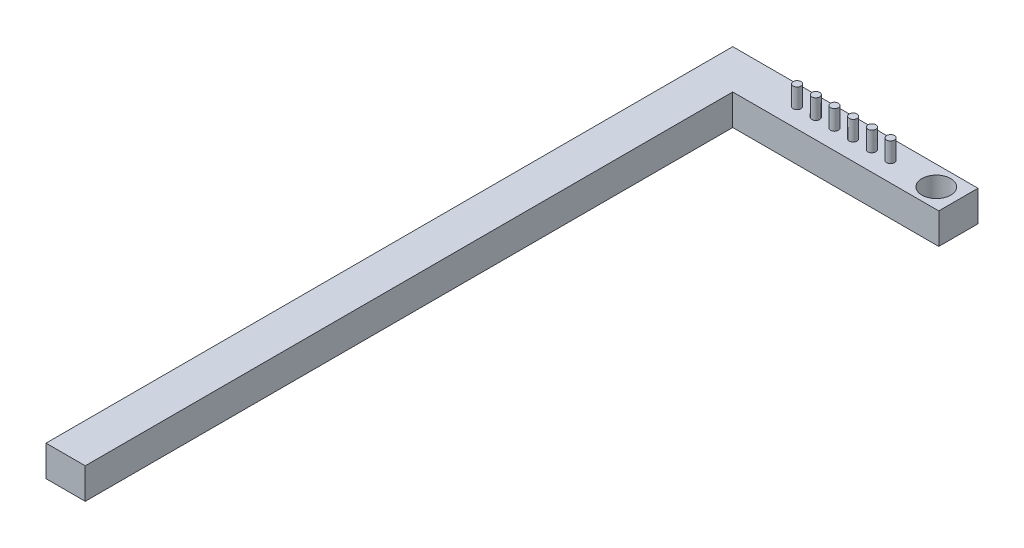
ISO-10303-21;
HEADER;
FILE_DESCRIPTION(('STEP AP214'),'2;1');
FILE_NAME('part.step','',(''),(''),'','','');
FILE_SCHEMA(('AUTOMOTIVE_DESIGN { 1 0 10303 214 1 1 1 1 }'));
ENDSEC;
DATA;
#1=APPLICATION_CONTEXT('core data for automotive mechanical design processes');
#2=APPLICATION_PROTOCOL_DEFINITION('international standard','automotive_design',2000,#1);
#3=PRODUCT_CONTEXT('',#1,'mechanical');
#4=PRODUCT('Part','Part','',(#3));
#5=PRODUCT_RELATED_PRODUCT_CATEGORY('part','',(#4));
#6=PRODUCT_DEFINITION_FORMATION('','',#4);
#7=PRODUCT_DEFINITION_CONTEXT('part definition',#1,'design');
#8=PRODUCT_DEFINITION('design','',#6,#7);
#9=PRODUCT_DEFINITION_SHAPE('','',#8);
#10=(LENGTH_UNIT() NAMED_UNIT(*) SI_UNIT(.MILLI.,.METRE.));
#11=(NAMED_UNIT(*) PLANE_ANGLE_UNIT() SI_UNIT($,.RADIAN.));
#12=(NAMED_UNIT(*) SI_UNIT($,.STERADIAN.) SOLID_ANGLE_UNIT());
#13=UNCERTAINTY_MEASURE_WITH_UNIT(LENGTH_MEASURE(1.E-05),#10,'distance_accuracy_value','');
#14=(GEOMETRIC_REPRESENTATION_CONTEXT(3) GLOBAL_UNCERTAINTY_ASSIGNED_CONTEXT((#13)) GLOBAL_UNIT_ASSIGNED_CONTEXT((#10,
#11,#12)) REPRESENTATION_CONTEXT('',''));
#15=CARTESIAN_POINT('',(0.,0.,0.));
#16=DIRECTION('',(0.,0.,1.));
#17=DIRECTION('',(1.,0.,0.));
#18=AXIS2_PLACEMENT_3D('',#15,#16,#17);
#19=CARTESIAN_POINT('',(0.,3.14,0.));
#20=DIRECTION('',(0.,-1.,0.));
#21=DIRECTION('',(0.,0.,-1.));
#22=AXIS2_PLACEMENT_3D('',#19,#20,#21);
#23=PLANE('',#22);
#24=CARTESIAN_POINT('',(5.58910010634148,3.14,0.000995637473865652));
#25=DIRECTION('',(0.,-1.,0.));
#26=DIRECTION('',(0.,0.,-1.));
#27=AXIS2_PLACEMENT_3D('',#24,#25,#26);
#28=CIRCLE('',#27,0.4);
#29=CARTESIAN_POINT('',(5.58910010634148,3.14,-0.399004362526135));
#30=VERTEX_POINT('',#29);
#31=EDGE_CURVE('E11',#30,#30,#28,.F.);
#32=ORIENTED_EDGE('',*,*,#31,.F.);
#33=EDGE_LOOP('',(#32));
#34=FACE_BOUND('',#33,.T.);
#35=CARTESIAN_POINT('',(3.6841001498053,3.14,0.00140257377108595));
#36=DIRECTION('',(0.,-1.,0.));
#37=DIRECTION('',(0.,0.,-1.));
#38=AXIS2_PLACEMENT_3D('',#35,#36,#37);
#39=CIRCLE('',#38,0.4);
#40=CARTESIAN_POINT('',(3.6841001498053,3.14,-0.398597426228915));
#41=VERTEX_POINT('',#40);
#42=EDGE_CURVE('E42',#41,#41,#39,.F.);
#43=ORIENTED_EDGE('',*,*,#42,.F.);
#44=EDGE_LOOP('',(#43));
#45=FACE_BOUND('',#44,.T.);
#46=CARTESIAN_POINT('',(1.77910019326912,3.14,0.00180951006830624));
#47=DIRECTION('',(0.,-1.,0.));
#48=DIRECTION('',(0.,0.,-1.));
#49=AXIS2_PLACEMENT_3D('',#46,#47,#48);
#50=CIRCLE('',#49,0.4);
#51=CARTESIAN_POINT('',(1.77910019326912,3.14,-0.398190489931694));
#52=VERTEX_POINT('',#51);
#53=EDGE_CURVE('E149',#52,#52,#50,.F.);
#54=ORIENTED_EDGE('',*,*,#53,.F.);
#55=EDGE_LOOP('',(#54));
#56=FACE_BOUND('',#55,.T.);
#57=CARTESIAN_POINT('',(-0.125899763267059,3.14,0.00221644636552653));
#58=DIRECTION('',(0.,-1.,0.));
#59=DIRECTION('',(0.,0.,-1.));
#60=AXIS2_PLACEMENT_3D('',#57,#58,#59);
#61=CIRCLE('',#60,0.4);
#62=CARTESIAN_POINT('',(-0.125899763267059,3.14,-0.397783553634473));
#63=VERTEX_POINT('',#62);
#64=EDGE_CURVE('E146',#63,#63,#61,.F.);
#65=ORIENTED_EDGE('',*,*,#64,.F.);
#66=EDGE_LOOP('',(#65));
#67=FACE_BOUND('',#66,.T.);
#68=CARTESIAN_POINT('',(-2.03089971980324,3.14,0.00262338266274683));
#69=DIRECTION('',(0.,-1.,0.));
#70=DIRECTION('',(0.,0.,-1.));
#71=AXIS2_PLACEMENT_3D('',#68,#69,#70);
#72=CIRCLE('',#71,0.4);
#73=CARTESIAN_POINT('',(-2.03089971980324,3.14,-0.397376617337253));
#74=VERTEX_POINT('',#73);
#75=EDGE_CURVE('E143',#74,#74,#72,.F.);
#76=ORIENTED_EDGE('',*,*,#75,.F.);
#77=EDGE_LOOP('',(#76));
#78=FACE_BOUND('',#77,.T.);
#79=CARTESIAN_POINT('',(-3.93589967633942,3.14,0.00303031895996539));
#80=DIRECTION('',(0.,-1.,0.));
#81=DIRECTION('',(0.,0.,-1.));
#82=AXIS2_PLACEMENT_3D('',#79,#80,#81);
#83=CIRCLE('',#82,0.4);
#84=CARTESIAN_POINT('',(-3.93589967633942,3.14,-0.396969681040035));
#85=VERTEX_POINT('',#84);
#86=EDGE_CURVE('E140',#85,#85,#83,.F.);
#87=ORIENTED_EDGE('',*,*,#86,.F.);
#88=EDGE_LOOP('',(#87));
#89=FACE_BOUND('',#88,.T.);
#90=DIRECTION('',(1.,0.,0.));
#91=VECTOR('',#90,1.);
#92=CARTESIAN_POINT('',(-8.49999999999999,3.14,2.));
#93=LINE('',#92,#91);
#94=CARTESIAN_POINT('',(-8.49999999999999,3.14,2.));
#95=VERTEX_POINT('',#94);
#96=CARTESIAN_POINT('',(12.5,3.14,2.));
#97=VERTEX_POINT('',#96);
#98=EDGE_CURVE('E131',#95,#97,#93,.T.);
#99=ORIENTED_EDGE('',*,*,#98,.T.);
#100=DIRECTION('',(0.,0.,-1.));
#101=VECTOR('',#100,1.);
#102=CARTESIAN_POINT('',(12.5,3.14,-2.));
#103=LINE('',#102,#101);
#104=CARTESIAN_POINT('',(12.5,3.14,-2.));
#105=VERTEX_POINT('',#104);
#106=EDGE_CURVE('E88',#97,#105,#103,.T.);
#107=ORIENTED_EDGE('',*,*,#106,.T.);
#108=DIRECTION('',(-1.,0.,0.));
#109=VECTOR('',#108,1.);
#110=CARTESIAN_POINT('',(-8.49999999999999,3.14,-2.));
#111=LINE('',#110,#109);
#112=CARTESIAN_POINT('',(-12.5,3.14,-2.));
#113=VERTEX_POINT('',#112);
#114=EDGE_CURVE('E101',#105,#113,#111,.T.);
#115=ORIENTED_EDGE('',*,*,#114,.T.);
#116=DIRECTION('',(0.,0.,1.));
#117=VECTOR('',#116,1.);
#118=CARTESIAN_POINT('',(-12.5,3.14,-2.));
#119=LINE('',#118,#117);
#120=CARTESIAN_POINT('',(-12.5,3.14,68.));
#121=VERTEX_POINT('',#120);
#122=EDGE_CURVE('E95',#113,#121,#119,.T.);
#123=ORIENTED_EDGE('',*,*,#122,.T.);
#124=DIRECTION('',(1.,0.,0.));
#125=VECTOR('',#124,1.);
#126=CARTESIAN_POINT('',(-8.49999999999998,3.14,68.));
#127=LINE('',#126,#125);
#128=CARTESIAN_POINT('',(-8.49999999999998,3.14,68.));
#129=VERTEX_POINT('',#128);
#130=EDGE_CURVE('E99',#121,#129,#127,.T.);
#131=ORIENTED_EDGE('',*,*,#130,.T.);
#132=DIRECTION('',(0.,0.,-1.));
#133=VECTOR('',#132,1.);
#134=CARTESIAN_POINT('',(-8.49999999999999,3.14,2.));
#135=LINE('',#134,#133);
#136=EDGE_CURVE('E50',#129,#95,#135,.T.);
#137=ORIENTED_EDGE('',*,*,#136,.T.);
#138=EDGE_LOOP('',(#99,#107,#115,#123,#131,#137));
#139=FACE_BOUND('',#138,.T.);
#140=CARTESIAN_POINT('',(10.25,3.14,0.));
#141=DIRECTION('',(0.,1.,0.));
#142=DIRECTION('',(0.,0.,1.));
#143=AXIS2_PLACEMENT_3D('',#140,#141,#142);
#144=CIRCLE('',#143,1.47);
#145=CARTESIAN_POINT('',(10.25,3.14,1.47));
#146=VERTEX_POINT('',#145);
#147=EDGE_CURVE('E123',#146,#146,#144,.T.);
#148=ORIENTED_EDGE('',*,*,#147,.F.);
#149=EDGE_LOOP('',(#148));
#150=FACE_BOUND('',#149,.T.);
#151=ADVANCED_FACE('F33',(#34,#45,#56,#67,#78,#89,#139,#150),#23,.F.);
#152=CARTESIAN_POINT('',(0.,0.,0.));
#153=DIRECTION('',(0.,-1.,0.));
#154=DIRECTION('',(0.,0.,-1.));
#155=AXIS2_PLACEMENT_3D('',#152,#153,#154);
#156=PLANE('',#155);
#157=DIRECTION('',(1.,0.,0.));
#158=VECTOR('',#157,1.);
#159=CARTESIAN_POINT('',(-8.49999999999999,0.,2.));
#160=LINE('',#159,#158);
#161=CARTESIAN_POINT('',(-8.49999999999999,0.,2.));
#162=VERTEX_POINT('',#161);
#163=CARTESIAN_POINT('',(12.5,0.,2.));
#164=VERTEX_POINT('',#163);
#165=EDGE_CURVE('E119',#162,#164,#160,.T.);
#166=ORIENTED_EDGE('',*,*,#165,.F.);
#167=DIRECTION('',(0.,0.,-1.));
#168=VECTOR('',#167,1.);
#169=CARTESIAN_POINT('',(-8.49999999999999,0.,2.));
#170=LINE('',#169,#168);
#171=CARTESIAN_POINT('',(-8.49999999999998,0.,68.));
#172=VERTEX_POINT('',#171);
#173=EDGE_CURVE('E79',#172,#162,#170,.T.);
#174=ORIENTED_EDGE('',*,*,#173,.F.);
#175=DIRECTION('',(1.,0.,0.));
#176=VECTOR('',#175,1.);
#177=CARTESIAN_POINT('',(-8.49999999999998,0.,68.));
#178=LINE('',#177,#176);
#179=CARTESIAN_POINT('',(-12.5,0.,68.));
#180=VERTEX_POINT('',#179);
#181=EDGE_CURVE('E73',#180,#172,#178,.T.);
#182=ORIENTED_EDGE('',*,*,#181,.F.);
#183=DIRECTION('',(0.,0.,1.));
#184=VECTOR('',#183,1.);
#185=CARTESIAN_POINT('',(-12.5,0.,-2.));
#186=LINE('',#185,#184);
#187=CARTESIAN_POINT('',(-12.5,0.,-2.));
#188=VERTEX_POINT('',#187);
#189=EDGE_CURVE('E109',#188,#180,#186,.T.);
#190=ORIENTED_EDGE('',*,*,#189,.F.);
#191=DIRECTION('',(-1.,0.,0.));
#192=VECTOR('',#191,1.);
#193=CARTESIAN_POINT('',(-8.49999999999999,0.,-2.));
#194=LINE('',#193,#192);
#195=CARTESIAN_POINT('',(12.5,0.,-2.));
#196=VERTEX_POINT('',#195);
#197=EDGE_CURVE('E126',#196,#188,#194,.T.);
#198=ORIENTED_EDGE('',*,*,#197,.F.);
#199=DIRECTION('',(0.,0.,-1.));
#200=VECTOR('',#199,1.);
#201=CARTESIAN_POINT('',(12.5,0.,-2.));
#202=LINE('',#201,#200);
#203=EDGE_CURVE('E122',#164,#196,#202,.T.);
#204=ORIENTED_EDGE('',*,*,#203,.F.);
#205=EDGE_LOOP('',(#166,#174,#182,#190,#198,#204));
#206=FACE_BOUND('',#205,.T.);
#207=CARTESIAN_POINT('',(10.25,0.,0.));
#208=DIRECTION('',(0.,1.,0.));
#209=DIRECTION('',(0.,0.,1.));
#210=AXIS2_PLACEMENT_3D('',#207,#208,#209);
#211=CIRCLE('',#210,1.47);
#212=CARTESIAN_POINT('',(10.25,0.,1.47));
#213=VERTEX_POINT('',#212);
#214=EDGE_CURVE('E211',#213,#213,#211,.T.);
#215=ORIENTED_EDGE('',*,*,#214,.T.);
#216=EDGE_LOOP('',(#215));
#217=FACE_BOUND('',#216,.T.);
#218=ADVANCED_FACE('F158',(#206,#217),#156,.T.);
#219=CARTESIAN_POINT('',(-8.49999999999999,3.14,2.));
#220=DIRECTION('',(0.,0.,-1.));
#221=DIRECTION('',(-1.,0.,0.));
#222=AXIS2_PLACEMENT_3D('',#219,#220,#221);
#223=PLANE('',#222);
#224=ORIENTED_EDGE('',*,*,#165,.T.);
#225=DIRECTION('',(0.,-1.,0.));
#226=VECTOR('',#225,1.);
#227=CARTESIAN_POINT('',(12.5,3.14,2.));
#228=LINE('',#227,#226);
#229=EDGE_CURVE('E138',#97,#164,#228,.T.);
#230=ORIENTED_EDGE('',*,*,#229,.F.);
#231=ORIENTED_EDGE('',*,*,#98,.F.);
#232=DIRECTION('',(0.,-1.,0.));
#233=VECTOR('',#232,1.);
#234=CARTESIAN_POINT('',(-8.49999999999999,3.14,2.));
#235=LINE('',#234,#233);
#236=EDGE_CURVE('E115',#95,#162,#235,.T.);
#237=ORIENTED_EDGE('',*,*,#236,.T.);
#238=EDGE_LOOP('',(#224,#230,#231,#237));
#239=FACE_BOUND('',#238,.T.);
#240=ADVANCED_FACE('F35',(#239),#223,.F.);
#241=CARTESIAN_POINT('',(12.5,3.14,-2.));
#242=DIRECTION('',(-1.,0.,0.));
#243=DIRECTION('',(0.,0.,1.));
#244=AXIS2_PLACEMENT_3D('',#241,#242,#243);
#245=PLANE('',#244);
#246=ORIENTED_EDGE('',*,*,#203,.T.);
#247=DIRECTION('',(0.,-1.,0.));
#248=VECTOR('',#247,1.);
#249=CARTESIAN_POINT('',(12.5,3.14,-2.));
#250=LINE('',#249,#248);
#251=EDGE_CURVE('E135',#105,#196,#250,.T.);
#252=ORIENTED_EDGE('',*,*,#251,.F.);
#253=ORIENTED_EDGE('',*,*,#106,.F.);
#254=ORIENTED_EDGE('',*,*,#229,.T.);
#255=EDGE_LOOP('',(#246,#252,#253,#254));
#256=FACE_BOUND('',#255,.T.);
#257=ADVANCED_FACE('F199',(#256),#245,.F.);
#258=CARTESIAN_POINT('',(-8.49999999999999,3.14,-2.));
#259=DIRECTION('',(0.,0.,1.));
#260=DIRECTION('',(1.,0.,0.));
#261=AXIS2_PLACEMENT_3D('',#258,#259,#260);
#262=PLANE('',#261);
#263=ORIENTED_EDGE('',*,*,#197,.T.);
#264=DIRECTION('',(0.,-1.,0.));
#265=VECTOR('',#264,1.);
#266=CARTESIAN_POINT('',(-12.5,3.14,-2.));
#267=LINE('',#266,#265);
#268=EDGE_CURVE('E110',#113,#188,#267,.T.);
#269=ORIENTED_EDGE('',*,*,#268,.F.);
#270=ORIENTED_EDGE('',*,*,#114,.F.);
#271=ORIENTED_EDGE('',*,*,#251,.T.);
#272=EDGE_LOOP('',(#263,#269,#270,#271));
#273=FACE_BOUND('',#272,.T.);
#274=ADVANCED_FACE('F197',(#273),#262,.F.);
#275=CARTESIAN_POINT('',(-12.5,3.14,-2.));
#276=DIRECTION('',(1.,0.,0.));
#277=DIRECTION('',(0.,0.,-1.));
#278=AXIS2_PLACEMENT_3D('',#275,#276,#277);
#279=PLANE('',#278);
#280=ORIENTED_EDGE('',*,*,#189,.T.);
#281=DIRECTION('',(0.,-1.,0.));
#282=VECTOR('',#281,1.);
#283=CARTESIAN_POINT('',(-12.5,3.14,68.));
#284=LINE('',#283,#282);
#285=EDGE_CURVE('E106',#121,#180,#284,.T.);
#286=ORIENTED_EDGE('',*,*,#285,.F.);
#287=ORIENTED_EDGE('',*,*,#122,.F.);
#288=ORIENTED_EDGE('',*,*,#268,.T.);
#289=EDGE_LOOP('',(#280,#286,#287,#288));
#290=FACE_BOUND('',#289,.T.);
#291=ADVANCED_FACE('F107',(#290),#279,.F.);
#292=CARTESIAN_POINT('',(-8.49999999999998,3.14,68.));
#293=DIRECTION('',(0.,0.,-1.));
#294=DIRECTION('',(-1.,0.,0.));
#295=AXIS2_PLACEMENT_3D('',#292,#293,#294);
#296=PLANE('',#295);
#297=ORIENTED_EDGE('',*,*,#181,.T.);
#298=DIRECTION('',(0.,-1.,0.));
#299=VECTOR('',#298,1.);
#300=CARTESIAN_POINT('',(-8.49999999999998,3.14,68.));
#301=LINE('',#300,#299);
#302=EDGE_CURVE('E111',#129,#172,#301,.T.);
#303=ORIENTED_EDGE('',*,*,#302,.F.);
#304=ORIENTED_EDGE('',*,*,#130,.F.);
#305=ORIENTED_EDGE('',*,*,#285,.T.);
#306=EDGE_LOOP('',(#297,#303,#304,#305));
#307=FACE_BOUND('',#306,.T.);
#308=ADVANCED_FACE('F113',(#307),#296,.F.);
#309=CARTESIAN_POINT('',(-8.49999999999999,3.14,2.));
#310=DIRECTION('',(-1.,0.,0.));
#311=DIRECTION('',(0.,0.,1.));
#312=AXIS2_PLACEMENT_3D('',#309,#310,#311);
#313=PLANE('',#312);
#314=ORIENTED_EDGE('',*,*,#173,.T.);
#315=ORIENTED_EDGE('',*,*,#236,.F.);
#316=ORIENTED_EDGE('',*,*,#136,.F.);
#317=ORIENTED_EDGE('',*,*,#302,.T.);
#318=EDGE_LOOP('',(#314,#315,#316,#317));
#319=FACE_BOUND('',#318,.T.);
#320=ADVANCED_FACE('F182',(#319),#313,.F.);
#321=CARTESIAN_POINT('',(10.25,3.14,0.));
#322=DIRECTION('',(0.,-1.,0.));
#323=DIRECTION('',(0.,0.,-1.));
#324=AXIS2_PLACEMENT_3D('',#321,#322,#323);
#325=CYLINDRICAL_SURFACE('',#324,1.47);
#326=ORIENTED_EDGE('',*,*,#147,.T.);
#327=EDGE_LOOP('',(#326));
#328=FACE_BOUND('',#327,.T.);
#329=ORIENTED_EDGE('',*,*,#214,.F.);
#330=EDGE_LOOP('',(#329));
#331=FACE_BOUND('',#330,.T.);
#332=ADVANCED_FACE('F172',(#328,#331),#325,.F.);
#333=CARTESIAN_POINT('',(-3.93589967633942,5.14,0.00303031895996539));
#334=DIRECTION('',(0.,-1.,0.));
#335=DIRECTION('',(0.,0.,-1.));
#336=AXIS2_PLACEMENT_3D('',#333,#334,#335);
#337=CYLINDRICAL_SURFACE('',#336,0.4);
#338=CARTESIAN_POINT('',(-3.93589967633942,5.14,0.00303031895996539));
#339=DIRECTION('',(0.,1.,0.));
#340=DIRECTION('',(0.,0.,1.));
#341=AXIS2_PLACEMENT_3D('',#338,#339,#340);
#342=CIRCLE('',#341,0.4);
#343=CARTESIAN_POINT('',(-3.93589967633942,5.14,0.403030318959966));
#344=VERTEX_POINT('',#343);
#345=EDGE_CURVE('E214',#344,#344,#342,.T.);
#346=ORIENTED_EDGE('',*,*,#345,.F.);
#347=EDGE_LOOP('',(#346));
#348=FACE_BOUND('',#347,.T.);
#349=ORIENTED_EDGE('',*,*,#86,.T.);
#350=EDGE_LOOP('',(#349));
#351=FACE_BOUND('',#350,.T.);
#352=ADVANCED_FACE('F169',(#348,#351),#337,.T.);
#353=CARTESIAN_POINT('',(-3.93589967633942,5.14,0.00303031895996539));
#354=DIRECTION('',(0.,1.,0.));
#355=DIRECTION('',(0.,0.,1.));
#356=AXIS2_PLACEMENT_3D('',#353,#354,#355);
#357=PLANE('',#356);
#358=ORIENTED_EDGE('',*,*,#345,.T.);
#359=EDGE_LOOP('',(#358));
#360=FACE_BOUND('',#359,.T.);
#361=ADVANCED_FACE('F171',(#360),#357,.T.);
#362=CARTESIAN_POINT('',(-2.03089971980324,5.14,0.00262338266274683));
#363=DIRECTION('',(0.,-1.,0.));
#364=DIRECTION('',(0.,0.,-1.));
#365=AXIS2_PLACEMENT_3D('',#362,#363,#364);
#366=CYLINDRICAL_SURFACE('',#365,0.4);
#367=CARTESIAN_POINT('',(-2.03089971980324,5.14,0.00262338266274683));
#368=DIRECTION('',(0.,1.,0.));
#369=DIRECTION('',(0.,0.,1.));
#370=AXIS2_PLACEMENT_3D('',#367,#368,#369);
#371=CIRCLE('',#370,0.4);
#372=CARTESIAN_POINT('',(-2.03089971980324,5.14,0.402623382662747));
#373=VERTEX_POINT('',#372);
#374=EDGE_CURVE('E219',#373,#373,#371,.T.);
#375=ORIENTED_EDGE('',*,*,#374,.F.);
#376=EDGE_LOOP('',(#375));
#377=FACE_BOUND('',#376,.T.);
#378=ORIENTED_EDGE('',*,*,#75,.T.);
#379=EDGE_LOOP('',(#378));
#380=FACE_BOUND('',#379,.T.);
#381=ADVANCED_FACE('F179',(#377,#380),#366,.T.);
#382=CARTESIAN_POINT('',(-2.03089971980324,5.14,0.00262338266274683));
#383=DIRECTION('',(0.,1.,0.));
#384=DIRECTION('',(0.,0.,1.));
#385=AXIS2_PLACEMENT_3D('',#382,#383,#384);
#386=PLANE('',#385);
#387=ORIENTED_EDGE('',*,*,#374,.T.);
#388=EDGE_LOOP('',(#387));
#389=FACE_BOUND('',#388,.T.);
#390=ADVANCED_FACE('F269',(#389),#386,.T.);
#391=CARTESIAN_POINT('',(-0.125899763267059,5.14,0.00221644636552653));
#392=DIRECTION('',(0.,-1.,0.));
#393=DIRECTION('',(0.,0.,-1.));
#394=AXIS2_PLACEMENT_3D('',#391,#392,#393);
#395=CYLINDRICAL_SURFACE('',#394,0.4);
#396=CARTESIAN_POINT('',(-0.125899763267059,5.14,0.00221644636552653));
#397=DIRECTION('',(0.,1.,0.));
#398=DIRECTION('',(0.,0.,1.));
#399=AXIS2_PLACEMENT_3D('',#396,#397,#398);
#400=CIRCLE('',#399,0.4);
#401=CARTESIAN_POINT('',(-0.125899763267059,5.14,0.402216446365527));
#402=VERTEX_POINT('',#401);
#403=EDGE_CURVE('E222',#402,#402,#400,.T.);
#404=ORIENTED_EDGE('',*,*,#403,.F.);
#405=EDGE_LOOP('',(#404));
#406=FACE_BOUND('',#405,.T.);
#407=ORIENTED_EDGE('',*,*,#64,.T.);
#408=EDGE_LOOP('',(#407));
#409=FACE_BOUND('',#408,.T.);
#410=ADVANCED_FACE('F265',(#406,#409),#395,.T.);
#411=CARTESIAN_POINT('',(-0.125899763267059,5.14,0.00221644636552653));
#412=DIRECTION('',(0.,1.,0.));
#413=DIRECTION('',(0.,0.,1.));
#414=AXIS2_PLACEMENT_3D('',#411,#412,#413);
#415=PLANE('',#414);
#416=ORIENTED_EDGE('',*,*,#403,.T.);
#417=EDGE_LOOP('',(#416));
#418=FACE_BOUND('',#417,.T.);
#419=ADVANCED_FACE('F261',(#418),#415,.T.);
#420=CARTESIAN_POINT('',(1.77910019326912,5.14,0.00180951006830624));
#421=DIRECTION('',(0.,-1.,0.));
#422=DIRECTION('',(0.,0.,-1.));
#423=AXIS2_PLACEMENT_3D('',#420,#421,#422);
#424=CYLINDRICAL_SURFACE('',#423,0.4);
#425=CARTESIAN_POINT('',(1.77910019326912,5.14,0.00180951006830624));
#426=DIRECTION('',(0.,1.,0.));
#427=DIRECTION('',(0.,0.,1.));
#428=AXIS2_PLACEMENT_3D('',#425,#426,#427);
#429=CIRCLE('',#428,0.4);
#430=CARTESIAN_POINT('',(1.77910019326912,5.14,0.401809510068307));
#431=VERTEX_POINT('',#430);
#432=EDGE_CURVE('E225',#431,#431,#429,.T.);
#433=ORIENTED_EDGE('',*,*,#432,.F.);
#434=EDGE_LOOP('',(#433));
#435=FACE_BOUND('',#434,.T.);
#436=ORIENTED_EDGE('',*,*,#53,.T.);
#437=EDGE_LOOP('',(#436));
#438=FACE_BOUND('',#437,.T.);
#439=ADVANCED_FACE('F257',(#435,#438),#424,.T.);
#440=CARTESIAN_POINT('',(1.77910019326912,5.14,0.00180951006830624));
#441=DIRECTION('',(0.,1.,0.));
#442=DIRECTION('',(0.,0.,1.));
#443=AXIS2_PLACEMENT_3D('',#440,#441,#442);
#444=PLANE('',#443);
#445=ORIENTED_EDGE('',*,*,#432,.T.);
#446=EDGE_LOOP('',(#445));
#447=FACE_BOUND('',#446,.T.);
#448=ADVANCED_FACE('F253',(#447),#444,.T.);
#449=CARTESIAN_POINT('',(3.6841001498053,5.14,0.00140257377108595));
#450=DIRECTION('',(0.,-1.,0.));
#451=DIRECTION('',(0.,0.,-1.));
#452=AXIS2_PLACEMENT_3D('',#449,#450,#451);
#453=CYLINDRICAL_SURFACE('',#452,0.4);
#454=CARTESIAN_POINT('',(3.6841001498053,5.14,0.00140257377108595));
#455=DIRECTION('',(0.,1.,0.));
#456=DIRECTION('',(0.,0.,1.));
#457=AXIS2_PLACEMENT_3D('',#454,#455,#456);
#458=CIRCLE('',#457,0.4);
#459=CARTESIAN_POINT('',(3.6841001498053,5.14,0.401402573771086));
#460=VERTEX_POINT('',#459);
#461=EDGE_CURVE('E228',#460,#460,#458,.T.);
#462=ORIENTED_EDGE('',*,*,#461,.F.);
#463=EDGE_LOOP('',(#462));
#464=FACE_BOUND('',#463,.T.);
#465=ORIENTED_EDGE('',*,*,#42,.T.);
#466=EDGE_LOOP('',(#465));
#467=FACE_BOUND('',#466,.T.);
#468=ADVANCED_FACE('F154',(#464,#467),#453,.T.);
#469=CARTESIAN_POINT('',(3.6841001498053,5.14,0.00140257377108595));
#470=DIRECTION('',(0.,1.,0.));
#471=DIRECTION('',(0.,0.,1.));
#472=AXIS2_PLACEMENT_3D('',#469,#470,#471);
#473=PLANE('',#472);
#474=ORIENTED_EDGE('',*,*,#461,.T.);
#475=EDGE_LOOP('',(#474));
#476=FACE_BOUND('',#475,.T.);
#477=ADVANCED_FACE('F240',(#476),#473,.T.);
#478=CARTESIAN_POINT('',(5.58910010634148,5.14,0.000995637473865652));
#479=DIRECTION('',(0.,-1.,0.));
#480=DIRECTION('',(0.,0.,-1.));
#481=AXIS2_PLACEMENT_3D('',#478,#479,#480);
#482=CYLINDRICAL_SURFACE('',#481,0.4);
#483=CARTESIAN_POINT('',(5.58910010634148,5.14,0.000995637473865652));
#484=DIRECTION('',(0.,1.,0.));
#485=DIRECTION('',(0.,0.,1.));
#486=AXIS2_PLACEMENT_3D('',#483,#484,#485);
#487=CIRCLE('',#486,0.4);
#488=CARTESIAN_POINT('',(5.58910010634148,5.14,0.400995637473866));
#489=VERTEX_POINT('',#488);
#490=EDGE_CURVE('E231',#489,#489,#487,.T.);
#491=ORIENTED_EDGE('',*,*,#490,.F.);
#492=EDGE_LOOP('',(#491));
#493=FACE_BOUND('',#492,.T.);
#494=ORIENTED_EDGE('',*,*,#31,.T.);
#495=EDGE_LOOP('',(#494));
#496=FACE_BOUND('',#495,.T.);
#497=ADVANCED_FACE('F237',(#493,#496),#482,.T.);
#498=CARTESIAN_POINT('',(5.58910010634148,5.14,0.000995637473865652));
#499=DIRECTION('',(0.,1.,0.));
#500=DIRECTION('',(0.,0.,1.));
#501=AXIS2_PLACEMENT_3D('',#498,#499,#500);
#502=PLANE('',#501);
#503=ORIENTED_EDGE('',*,*,#490,.T.);
#504=EDGE_LOOP('',(#503));
#505=FACE_BOUND('',#504,.T.);
#506=ADVANCED_FACE('F235',(#505),#502,.T.);
#507=CLOSED_SHELL('',(#151,#218,#240,#257,#274,#291,#308,#320,#332,#352,#361,#381,#390,#410,
#419,#439,#448,#468,#477,#497,#506));
#508=MANIFOLD_SOLID_BREP('B2',#507);
#509=ADVANCED_BREP_SHAPE_REPRESENTATION('',(#18,#508),#14);
#510=SHAPE_DEFINITION_REPRESENTATION(#9,#509);
ENDSEC;
END-ISO-10303-21;
